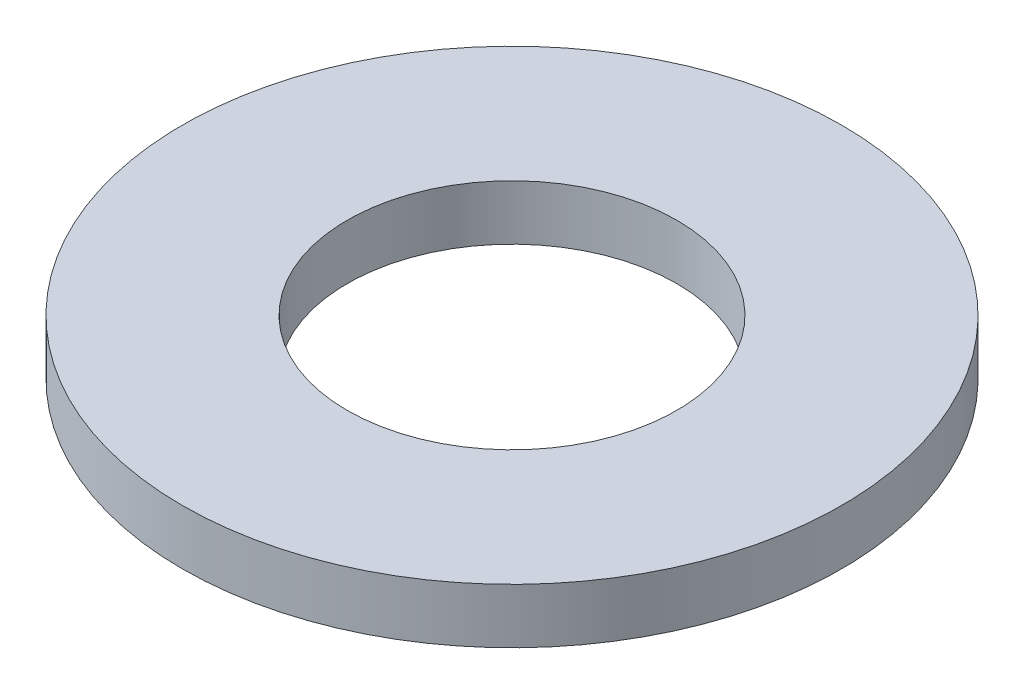
ISO-10303-21;
HEADER;
FILE_DESCRIPTION(('STEP AP214'),'2;1');
FILE_NAME('part.step','',(''),(''),'','','');
FILE_SCHEMA(('AUTOMOTIVE_DESIGN { 1 0 10303 214 1 1 1 1 }'));
ENDSEC;
DATA;
#1=APPLICATION_CONTEXT('core data for automotive mechanical design processes');
#2=APPLICATION_PROTOCOL_DEFINITION('international standard','automotive_design',2000,#1);
#3=PRODUCT_CONTEXT('',#1,'mechanical');
#4=PRODUCT('Part','Part','',(#3));
#5=PRODUCT_RELATED_PRODUCT_CATEGORY('part','',(#4));
#6=PRODUCT_DEFINITION_FORMATION('','',#4);
#7=PRODUCT_DEFINITION_CONTEXT('part definition',#1,'design');
#8=PRODUCT_DEFINITION('design','',#6,#7);
#9=PRODUCT_DEFINITION_SHAPE('','',#8);
#10=(LENGTH_UNIT() NAMED_UNIT(*) SI_UNIT(.MILLI.,.METRE.));
#11=(NAMED_UNIT(*) PLANE_ANGLE_UNIT() SI_UNIT($,.RADIAN.));
#12=(NAMED_UNIT(*) SI_UNIT($,.STERADIAN.) SOLID_ANGLE_UNIT());
#13=UNCERTAINTY_MEASURE_WITH_UNIT(LENGTH_MEASURE(1.E-05),#10,'distance_accuracy_value','');
#14=(GEOMETRIC_REPRESENTATION_CONTEXT(3) GLOBAL_UNCERTAINTY_ASSIGNED_CONTEXT((#13)) GLOBAL_UNIT_ASSIGNED_CONTEXT((#10,
#11,#12)) REPRESENTATION_CONTEXT('',''));
#15=CARTESIAN_POINT('',(0.,0.,0.));
#16=DIRECTION('',(0.,0.,1.));
#17=DIRECTION('',(1.,0.,0.));
#18=AXIS2_PLACEMENT_3D('',#15,#16,#17);
#19=CARTESIAN_POINT('',(0.,0.5,0.));
#20=DIRECTION('',(0.,1.,0.));
#21=DIRECTION('',(0.,0.,1.));
#22=AXIS2_PLACEMENT_3D('',#19,#20,#21);
#23=PLANE('',#22);
#24=CARTESIAN_POINT('',(0.,0.5,0.));
#25=DIRECTION('',(0.,1.,0.));
#26=DIRECTION('',(0.,0.,1.));
#27=AXIS2_PLACEMENT_3D('',#24,#25,#26);
#28=CIRCLE('',#27,3.);
#29=CARTESIAN_POINT('',(0.,0.5,3.));
#30=VERTEX_POINT('',#29);
#31=EDGE_CURVE('E10',#30,#30,#28,.T.);
#32=ORIENTED_EDGE('',*,*,#31,.T.);
#33=EDGE_LOOP('',(#32));
#34=FACE_BOUND('',#33,.T.);
#35=CARTESIAN_POINT('',(0.,0.5,0.));
#36=DIRECTION('',(0.,1.,0.));
#37=DIRECTION('',(0.,0.,1.));
#38=AXIS2_PLACEMENT_3D('',#35,#36,#37);
#39=CIRCLE('',#38,1.5);
#40=CARTESIAN_POINT('',(0.,0.5,1.5));
#41=VERTEX_POINT('',#40);
#42=EDGE_CURVE('E42',#41,#41,#39,.T.);
#43=ORIENTED_EDGE('',*,*,#42,.F.);
#44=EDGE_LOOP('',(#43));
#45=FACE_BOUND('',#44,.T.);
#46=ADVANCED_FACE('F31',(#34,#45),#23,.T.);
#47=CARTESIAN_POINT('',(0.,0.,0.));
#48=DIRECTION('',(0.,1.,0.));
#49=DIRECTION('',(0.,0.,1.));
#50=AXIS2_PLACEMENT_3D('',#47,#48,#49);
#51=PLANE('',#50);
#52=CARTESIAN_POINT('',(0.,0.,0.));
#53=DIRECTION('',(0.,1.,0.));
#54=DIRECTION('',(0.,0.,1.));
#55=AXIS2_PLACEMENT_3D('',#52,#53,#54);
#56=CIRCLE('',#55,3.);
#57=CARTESIAN_POINT('',(0.,0.,3.));
#58=VERTEX_POINT('',#57);
#59=EDGE_CURVE('E35',#58,#58,#56,.T.);
#60=ORIENTED_EDGE('',*,*,#59,.F.);
#61=EDGE_LOOP('',(#60));
#62=FACE_BOUND('',#61,.T.);
#63=CARTESIAN_POINT('',(0.,0.,0.));
#64=DIRECTION('',(0.,1.,0.));
#65=DIRECTION('',(0.,0.,1.));
#66=AXIS2_PLACEMENT_3D('',#63,#64,#65);
#67=CIRCLE('',#66,1.5);
#68=CARTESIAN_POINT('',(0.,0.,1.5));
#69=VERTEX_POINT('',#68);
#70=EDGE_CURVE('E44',#69,#69,#67,.T.);
#71=ORIENTED_EDGE('',*,*,#70,.T.);
#72=EDGE_LOOP('',(#71));
#73=FACE_BOUND('',#72,.T.);
#74=ADVANCED_FACE('F54',(#62,#73),#51,.F.);
#75=CARTESIAN_POINT('',(0.,0.5,0.));
#76=DIRECTION('',(0.,-1.,0.));
#77=DIRECTION('',(0.,0.,-1.));
#78=AXIS2_PLACEMENT_3D('',#75,#76,#77);
#79=CYLINDRICAL_SURFACE('',#78,3.);
#80=ORIENTED_EDGE('',*,*,#31,.F.);
#81=EDGE_LOOP('',(#80));
#82=FACE_BOUND('',#81,.T.);
#83=ORIENTED_EDGE('',*,*,#59,.T.);
#84=EDGE_LOOP('',(#83));
#85=FACE_BOUND('',#84,.T.);
#86=ADVANCED_FACE('F33',(#82,#85),#79,.T.);
#87=CARTESIAN_POINT('',(0.,0.5,0.));
#88=DIRECTION('',(0.,-1.,0.));
#89=DIRECTION('',(0.,0.,-1.));
#90=AXIS2_PLACEMENT_3D('',#87,#88,#89);
#91=CYLINDRICAL_SURFACE('',#90,1.5);
#92=ORIENTED_EDGE('',*,*,#42,.T.);
#93=EDGE_LOOP('',(#92));
#94=FACE_BOUND('',#93,.T.);
#95=ORIENTED_EDGE('',*,*,#70,.F.);
#96=EDGE_LOOP('',(#95));
#97=FACE_BOUND('',#96,.T.);
#98=ADVANCED_FACE('F50',(#94,#97),#91,.F.);
#99=CLOSED_SHELL('',(#46,#74,#86,#98));
#100=MANIFOLD_SOLID_BREP('B2',#99);
#101=ADVANCED_BREP_SHAPE_REPRESENTATION('',(#18,#100),#14);
#102=SHAPE_DEFINITION_REPRESENTATION(#9,#101);
ENDSEC;
END-ISO-10303-21;
